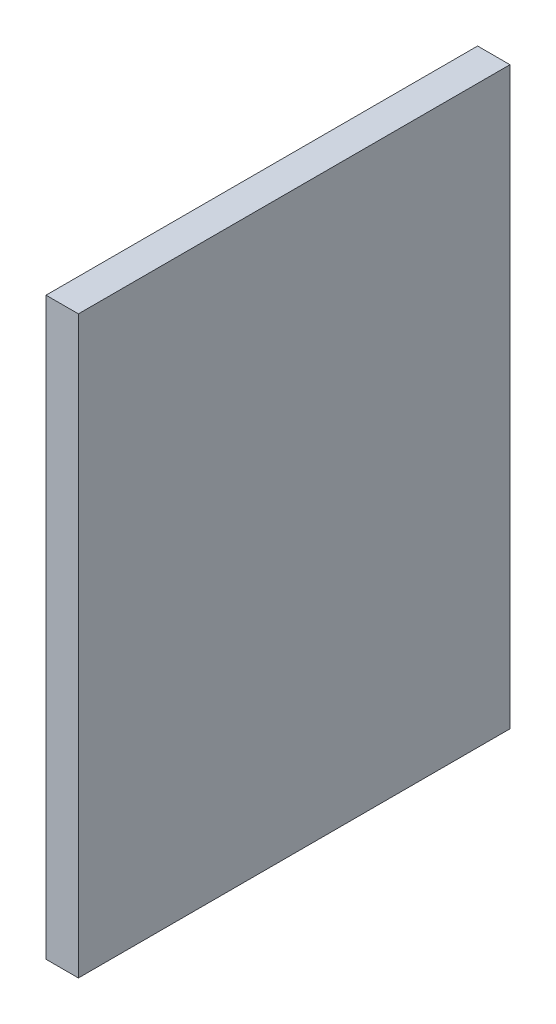
ISO-10303-21;
HEADER;
FILE_DESCRIPTION(('STEP AP214'),'2;1');
FILE_NAME('part.step','',(''),(''),'','','');
FILE_SCHEMA(('AUTOMOTIVE_DESIGN { 1 0 10303 214 1 1 1 1 }'));
ENDSEC;
DATA;
#1=APPLICATION_CONTEXT('core data for automotive mechanical design processes');
#2=APPLICATION_PROTOCOL_DEFINITION('international standard','automotive_design',2000,#1);
#3=PRODUCT_CONTEXT('',#1,'mechanical');
#4=PRODUCT('Part','Part','',(#3));
#5=PRODUCT_RELATED_PRODUCT_CATEGORY('part','',(#4));
#6=PRODUCT_DEFINITION_FORMATION('','',#4);
#7=PRODUCT_DEFINITION_CONTEXT('part definition',#1,'design');
#8=PRODUCT_DEFINITION('design','',#6,#7);
#9=PRODUCT_DEFINITION_SHAPE('','',#8);
#10=(LENGTH_UNIT() NAMED_UNIT(*) SI_UNIT(.MILLI.,.METRE.));
#11=(NAMED_UNIT(*) PLANE_ANGLE_UNIT() SI_UNIT($,.RADIAN.));
#12=(NAMED_UNIT(*) SI_UNIT($,.STERADIAN.) SOLID_ANGLE_UNIT());
#13=UNCERTAINTY_MEASURE_WITH_UNIT(LENGTH_MEASURE(1.E-05),#10,'distance_accuracy_value','');
#14=(GEOMETRIC_REPRESENTATION_CONTEXT(3) GLOBAL_UNCERTAINTY_ASSIGNED_CONTEXT((#13)) GLOBAL_UNIT_ASSIGNED_CONTEXT((#10,
#11,#12)) REPRESENTATION_CONTEXT('',''));
#15=CARTESIAN_POINT('',(0.,0.,0.));
#16=DIRECTION('',(0.,0.,1.));
#17=DIRECTION('',(1.,0.,0.));
#18=AXIS2_PLACEMENT_3D('',#15,#16,#17);
#19=CARTESIAN_POINT('',(3.,18.273381294964,-20.));
#20=DIRECTION('',(0.,0.,1.));
#21=DIRECTION('',(1.,0.,0.));
#22=AXIS2_PLACEMENT_3D('',#19,#20,#21);
#23=PLANE('',#22);
#24=DIRECTION('',(0.,1.,0.));
#25=VECTOR('',#24,1.);
#26=CARTESIAN_POINT('',(0.,18.273381294964,-20.));
#27=LINE('',#26,#25);
#28=CARTESIAN_POINT('',(0.,-35.0372706816227,-20.));
#29=VERTEX_POINT('',#28);
#30=CARTESIAN_POINT('',(0.,18.273381294964,-20.));
#31=VERTEX_POINT('',#30);
#32=EDGE_CURVE('E104',#29,#31,#27,.T.);
#33=ORIENTED_EDGE('',*,*,#32,.T.);
#34=DIRECTION('',(-1.,0.,0.));
#35=VECTOR('',#34,1.);
#36=CARTESIAN_POINT('',(3.,18.273381294964,-20.));
#37=LINE('',#36,#35);
#38=CARTESIAN_POINT('',(3.,18.273381294964,-20.));
#39=VERTEX_POINT('',#38);
#40=EDGE_CURVE('E11',#39,#31,#37,.T.);
#41=ORIENTED_EDGE('',*,*,#40,.F.);
#42=DIRECTION('',(0.,1.,0.));
#43=VECTOR('',#42,1.);
#44=CARTESIAN_POINT('',(3.,18.273381294964,-20.));
#45=LINE('',#44,#43);
#46=CARTESIAN_POINT('',(3.,-35.0372706816227,-20.));
#47=VERTEX_POINT('',#46);
#48=EDGE_CURVE('E92',#47,#39,#45,.T.);
#49=ORIENTED_EDGE('',*,*,#48,.F.);
#50=DIRECTION('',(-1.,0.,0.));
#51=VECTOR('',#50,1.);
#52=CARTESIAN_POINT('',(3.,-35.0372706816227,-20.));
#53=LINE('',#52,#51);
#54=EDGE_CURVE('E100',#47,#29,#53,.T.);
#55=ORIENTED_EDGE('',*,*,#54,.T.);
#56=EDGE_LOOP('',(#33,#41,#49,#55));
#57=FACE_BOUND('',#56,.T.);
#58=ADVANCED_FACE('F41',(#57),#23,.F.);
#59=CARTESIAN_POINT('',(3.,18.273381294964,20.));
#60=DIRECTION('',(0.,-1.,0.));
#61=DIRECTION('',(0.,0.,-1.));
#62=AXIS2_PLACEMENT_3D('',#59,#60,#61);
#63=PLANE('',#62);
#64=DIRECTION('',(0.,0.,1.));
#65=VECTOR('',#64,1.);
#66=CARTESIAN_POINT('',(0.,18.273381294964,20.));
#67=LINE('',#66,#65);
#68=CARTESIAN_POINT('',(0.,18.273381294964,20.));
#69=VERTEX_POINT('',#68);
#70=EDGE_CURVE('E96',#31,#69,#67,.T.);
#71=ORIENTED_EDGE('',*,*,#70,.T.);
#72=DIRECTION('',(-1.,0.,0.));
#73=VECTOR('',#72,1.);
#74=CARTESIAN_POINT('',(3.,18.273381294964,20.));
#75=LINE('',#74,#73);
#76=CARTESIAN_POINT('',(3.,18.273381294964,20.));
#77=VERTEX_POINT('',#76);
#78=EDGE_CURVE('E49',#77,#69,#75,.T.);
#79=ORIENTED_EDGE('',*,*,#78,.F.);
#80=DIRECTION('',(0.,0.,1.));
#81=VECTOR('',#80,1.);
#82=CARTESIAN_POINT('',(3.,18.273381294964,20.));
#83=LINE('',#82,#81);
#84=EDGE_CURVE('E87',#39,#77,#83,.T.);
#85=ORIENTED_EDGE('',*,*,#84,.F.);
#86=ORIENTED_EDGE('',*,*,#40,.T.);
#87=EDGE_LOOP('',(#71,#79,#85,#86));
#88=FACE_BOUND('',#87,.T.);
#89=ADVANCED_FACE('F95',(#88),#63,.F.);
#90=CARTESIAN_POINT('',(3.,18.273381294964,20.));
#91=DIRECTION('',(0.,0.,-1.));
#92=DIRECTION('',(-1.,0.,0.));
#93=AXIS2_PLACEMENT_3D('',#90,#91,#92);
#94=PLANE('',#93);
#95=DIRECTION('',(0.,-1.,0.));
#96=VECTOR('',#95,1.);
#97=CARTESIAN_POINT('',(0.,18.273381294964,20.));
#98=LINE('',#97,#96);
#99=CARTESIAN_POINT('',(0.,-35.0372706816227,20.));
#100=VERTEX_POINT('',#99);
#101=EDGE_CURVE('E74',#69,#100,#98,.T.);
#102=ORIENTED_EDGE('',*,*,#101,.T.);
#103=DIRECTION('',(-1.,0.,0.));
#104=VECTOR('',#103,1.);
#105=CARTESIAN_POINT('',(3.,-35.0372706816227,20.));
#106=LINE('',#105,#104);
#107=CARTESIAN_POINT('',(3.,-35.0372706816227,20.));
#108=VERTEX_POINT('',#107);
#109=EDGE_CURVE('E97',#108,#100,#106,.T.);
#110=ORIENTED_EDGE('',*,*,#109,.F.);
#111=DIRECTION('',(0.,-1.,0.));
#112=VECTOR('',#111,1.);
#113=CARTESIAN_POINT('',(3.,18.273381294964,20.));
#114=LINE('',#113,#112);
#115=EDGE_CURVE('E90',#77,#108,#114,.T.);
#116=ORIENTED_EDGE('',*,*,#115,.F.);
#117=ORIENTED_EDGE('',*,*,#78,.T.);
#118=EDGE_LOOP('',(#102,#110,#116,#117));
#119=FACE_BOUND('',#118,.T.);
#120=ADVANCED_FACE('F98',(#119),#94,.F.);
#121=CARTESIAN_POINT('',(3.,-35.0372706816227,20.));
#122=DIRECTION('',(0.,1.,0.));
#123=DIRECTION('',(0.,0.,1.));
#124=AXIS2_PLACEMENT_3D('',#121,#122,#123);
#125=PLANE('',#124);
#126=DIRECTION('',(0.,0.,-1.));
#127=VECTOR('',#126,1.);
#128=CARTESIAN_POINT('',(0.,-35.0372706816227,20.));
#129=LINE('',#128,#127);
#130=EDGE_CURVE('E80',#100,#29,#129,.T.);
#131=ORIENTED_EDGE('',*,*,#130,.T.);
#132=ORIENTED_EDGE('',*,*,#54,.F.);
#133=DIRECTION('',(0.,0.,-1.));
#134=VECTOR('',#133,1.);
#135=CARTESIAN_POINT('',(3.,-35.0372706816227,20.));
#136=LINE('',#135,#134);
#137=EDGE_CURVE('E57',#108,#47,#136,.T.);
#138=ORIENTED_EDGE('',*,*,#137,.F.);
#139=ORIENTED_EDGE('',*,*,#109,.T.);
#140=EDGE_LOOP('',(#131,#132,#138,#139));
#141=FACE_BOUND('',#140,.T.);
#142=ADVANCED_FACE('F111',(#141),#125,.F.);
#143=CARTESIAN_POINT('',(3.,0.,0.));
#144=DIRECTION('',(1.,0.,0.));
#145=DIRECTION('',(0.,0.,-1.));
#146=AXIS2_PLACEMENT_3D('',#143,#144,#145);
#147=PLANE('',#146);
#148=ORIENTED_EDGE('',*,*,#48,.T.);
#149=ORIENTED_EDGE('',*,*,#84,.T.);
#150=ORIENTED_EDGE('',*,*,#115,.T.);
#151=ORIENTED_EDGE('',*,*,#137,.T.);
#152=EDGE_LOOP('',(#148,#149,#150,#151));
#153=FACE_BOUND('',#152,.T.);
#154=ADVANCED_FACE('F88',(#153),#147,.T.);
#155=CARTESIAN_POINT('',(0.,0.,0.));
#156=DIRECTION('',(1.,0.,0.));
#157=DIRECTION('',(0.,0.,-1.));
#158=AXIS2_PLACEMENT_3D('',#155,#156,#157);
#159=PLANE('',#158);
#160=ORIENTED_EDGE('',*,*,#32,.F.);
#161=ORIENTED_EDGE('',*,*,#130,.F.);
#162=ORIENTED_EDGE('',*,*,#101,.F.);
#163=ORIENTED_EDGE('',*,*,#70,.F.);
#164=EDGE_LOOP('',(#160,#161,#162,#163));
#165=FACE_BOUND('',#164,.T.);
#166=ADVANCED_FACE('F114',(#165),#159,.F.);
#167=CLOSED_SHELL('',(#58,#89,#120,#142,#154,#166));
#168=MANIFOLD_SOLID_BREP('B2',#167);
#169=ADVANCED_BREP_SHAPE_REPRESENTATION('',(#18,#168),#14);
#170=SHAPE_DEFINITION_REPRESENTATION(#9,#169);
ENDSEC;
END-ISO-10303-21;
